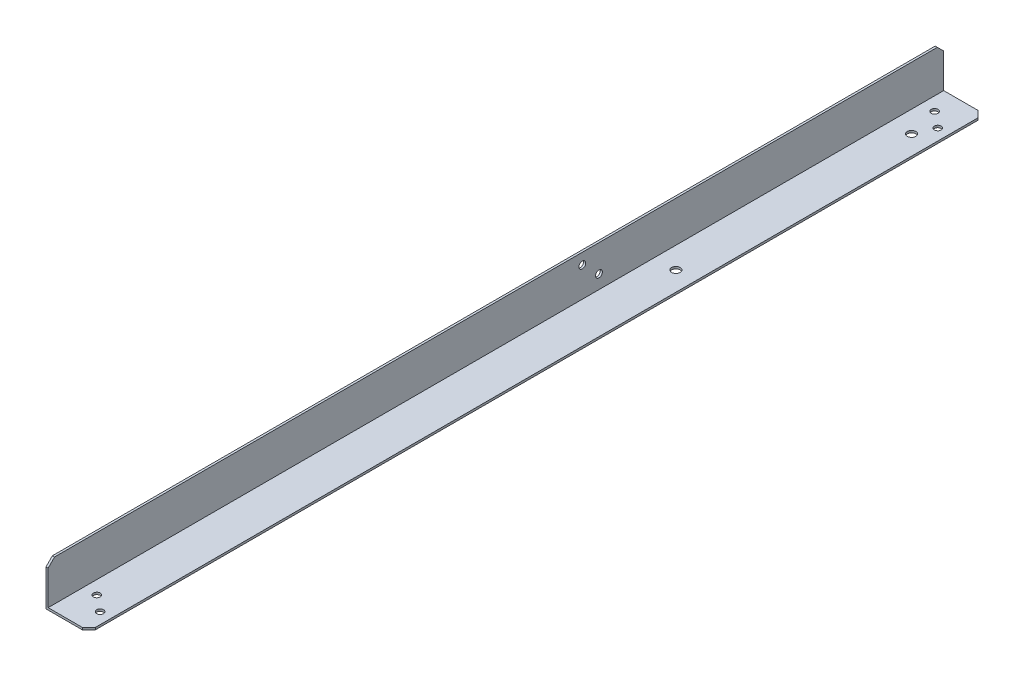
ISO-10303-21;
HEADER;
FILE_DESCRIPTION(('STEP AP214'),'2;1');
FILE_NAME('part.step','',(''),(''),'','','');
FILE_SCHEMA(('AUTOMOTIVE_DESIGN { 1 0 10303 214 1 1 1 1 }'));
ENDSEC;
DATA;
#1=APPLICATION_CONTEXT('core data for automotive mechanical design processes');
#2=APPLICATION_PROTOCOL_DEFINITION('international standard','automotive_design',2000,#1);
#3=PRODUCT_CONTEXT('',#1,'mechanical');
#4=PRODUCT('Part','Part','',(#3));
#5=PRODUCT_RELATED_PRODUCT_CATEGORY('part','',(#4));
#6=PRODUCT_DEFINITION_FORMATION('','',#4);
#7=PRODUCT_DEFINITION_CONTEXT('part definition',#1,'design');
#8=PRODUCT_DEFINITION('design','',#6,#7);
#9=PRODUCT_DEFINITION_SHAPE('','',#8);
#10=(LENGTH_UNIT() NAMED_UNIT(*) SI_UNIT(.MILLI.,.METRE.));
#11=(NAMED_UNIT(*) PLANE_ANGLE_UNIT() SI_UNIT($,.RADIAN.));
#12=(NAMED_UNIT(*) SI_UNIT($,.STERADIAN.) SOLID_ANGLE_UNIT());
#13=UNCERTAINTY_MEASURE_WITH_UNIT(LENGTH_MEASURE(1.E-05),#10,'distance_accuracy_value','');
#14=(GEOMETRIC_REPRESENTATION_CONTEXT(3) GLOBAL_UNCERTAINTY_ASSIGNED_CONTEXT((#13)) GLOBAL_UNIT_ASSIGNED_CONTEXT((#10,
#11,#12)) REPRESENTATION_CONTEXT('',''));
#15=CARTESIAN_POINT('',(0.,0.,0.));
#16=DIRECTION('',(0.,0.,1.));
#17=DIRECTION('',(1.,0.,0.));
#18=AXIS2_PLACEMENT_3D('',#15,#16,#17);
#19=CARTESIAN_POINT('',(20.,1.,418.));
#20=DIRECTION('',(0.,-1.,0.));
#21=DIRECTION('',(1.,0.,0.));
#22=AXIS2_PLACEMENT_3D('',#19,#20,#21);
#23=PLANE('',#22);
#24=CARTESIAN_POINT('',(11.,0.999999999999999,25.));
#25=DIRECTION('',(0.,1.,0.));
#26=DIRECTION('',(0.,0.,1.));
#27=AXIS2_PLACEMENT_3D('',#24,#25,#26);
#28=CIRCLE('',#27,2.);
#29=CARTESIAN_POINT('',(11.,0.999999999999999,27.));
#30=VERTEX_POINT('',#29);
#31=EDGE_CURVE('E250',#30,#30,#28,.T.);
#32=ORIENTED_EDGE('',*,*,#31,.F.);
#33=EDGE_LOOP('',(#32));
#34=FACE_BOUND('',#33,.T.);
#35=CARTESIAN_POINT('',(11.,0.999999999999999,135.));
#36=DIRECTION('',(0.,1.,0.));
#37=DIRECTION('',(0.,0.,1.));
#38=AXIS2_PLACEMENT_3D('',#35,#36,#37);
#39=CIRCLE('',#38,2.);
#40=CARTESIAN_POINT('',(11.,0.999999999999999,137.));
#41=VERTEX_POINT('',#40);
#42=EDGE_CURVE('E244',#41,#41,#39,.T.);
#43=ORIENTED_EDGE('',*,*,#42,.F.);
#44=EDGE_LOOP('',(#43));
#45=FACE_BOUND('',#44,.T.);
#46=CARTESIAN_POINT('',(14.75,1.,407.5));
#47=DIRECTION('',(0.,1.,0.));
#48=DIRECTION('',(0.,0.,1.));
#49=AXIS2_PLACEMENT_3D('',#46,#47,#48);
#50=CIRCLE('',#49,1.59999999999999);
#51=CARTESIAN_POINT('',(14.75,1.,409.1));
#52=VERTEX_POINT('',#51);
#53=EDGE_CURVE('E232',#52,#52,#50,.T.);
#54=ORIENTED_EDGE('',*,*,#53,.F.);
#55=EDGE_LOOP('',(#54));
#56=FACE_BOUND('',#55,.T.);
#57=CARTESIAN_POINT('',(7.25,1.,10.5));
#58=DIRECTION('',(0.,1.,0.));
#59=DIRECTION('',(0.,0.,1.));
#60=AXIS2_PLACEMENT_3D('',#57,#58,#59);
#61=CIRCLE('',#60,1.59999999999999);
#62=CARTESIAN_POINT('',(7.25,1.,12.1));
#63=VERTEX_POINT('',#62);
#64=EDGE_CURVE('E226',#63,#63,#61,.T.);
#65=ORIENTED_EDGE('',*,*,#64,.F.);
#66=EDGE_LOOP('',(#65));
#67=FACE_BOUND('',#66,.T.);
#68=CARTESIAN_POINT('',(14.75,1.,16.5));
#69=DIRECTION('',(0.,1.,0.));
#70=DIRECTION('',(0.,0.,1.));
#71=AXIS2_PLACEMENT_3D('',#68,#69,#70);
#72=CIRCLE('',#71,1.59999999999999);
#73=CARTESIAN_POINT('',(14.75,1.,18.1));
#74=VERTEX_POINT('',#73);
#75=EDGE_CURVE('E220',#74,#74,#72,.T.);
#76=ORIENTED_EDGE('',*,*,#75,.F.);
#77=EDGE_LOOP('',(#76));
#78=FACE_BOUND('',#77,.T.);
#79=DIRECTION('',(-1.,0.,0.));
#80=VECTOR('',#79,1.);
#81=CARTESIAN_POINT('',(20.,1.,418.));
#82=LINE('',#81,#80);
#83=CARTESIAN_POINT('',(17.,1.,418.));
#84=VERTEX_POINT('',#83);
#85=CARTESIAN_POINT('',(1.,0.999999999999998,418.));
#86=VERTEX_POINT('',#85);
#87=EDGE_CURVE('E135',#84,#86,#82,.T.);
#88=ORIENTED_EDGE('',*,*,#87,.F.);
#89=DIRECTION('',(0.707106781186541,0.,-0.707106781186554));
#90=VECTOR('',#89,1.);
#91=CARTESIAN_POINT('',(17.,1.,418.));
#92=LINE('',#91,#90);
#93=CARTESIAN_POINT('',(20.,1.,415.));
#94=VERTEX_POINT('',#93);
#95=EDGE_CURVE('E152',#84,#94,#92,.T.);
#96=ORIENTED_EDGE('',*,*,#95,.T.);
#97=DIRECTION('',(0.,0.,-1.));
#98=VECTOR('',#97,1.);
#99=CARTESIAN_POINT('',(20.,1.,418.));
#100=LINE('',#99,#98);
#101=CARTESIAN_POINT('',(20.,1.,2.99999999999995));
#102=VERTEX_POINT('',#101);
#103=EDGE_CURVE('E145',#94,#102,#100,.T.);
#104=ORIENTED_EDGE('',*,*,#103,.T.);
#105=DIRECTION('',(0.707106781186554,0.,0.707106781186541));
#106=VECTOR('',#105,1.);
#107=CARTESIAN_POINT('',(20.,1.,2.99999999999995));
#108=LINE('',#107,#106);
#109=CARTESIAN_POINT('',(17.,1.,0.));
#110=VERTEX_POINT('',#109);
#111=EDGE_CURVE('E150',#102,#110,#108,.F.);
#112=ORIENTED_EDGE('',*,*,#111,.T.);
#113=DIRECTION('',(-1.,0.,0.));
#114=VECTOR('',#113,1.);
#115=CARTESIAN_POINT('',(20.,1.,0.));
#116=LINE('',#115,#114);
#117=CARTESIAN_POINT('',(1.,0.999999999999998,0.));
#118=VERTEX_POINT('',#117);
#119=EDGE_CURVE('E177',#110,#118,#116,.T.);
#120=ORIENTED_EDGE('',*,*,#119,.T.);
#121=DIRECTION('',(0.,0.,-1.));
#122=VECTOR('',#121,1.);
#123=CARTESIAN_POINT('',(1.,0.999999999999998,418.));
#124=LINE('',#123,#122);
#125=EDGE_CURVE('E190',#86,#118,#124,.T.);
#126=ORIENTED_EDGE('',*,*,#125,.F.);
#127=EDGE_LOOP('',(#88,#96,#104,#112,#120,#126));
#128=FACE_BOUND('',#127,.T.);
#129=CARTESIAN_POINT('',(7.25,1.,401.5));
#130=DIRECTION('',(0.,1.,0.));
#131=DIRECTION('',(0.,0.,1.));
#132=AXIS2_PLACEMENT_3D('',#129,#130,#131);
#133=CIRCLE('',#132,1.59999999999999);
#134=CARTESIAN_POINT('',(7.25,1.,403.1));
#135=VERTEX_POINT('',#134);
#136=EDGE_CURVE('E238',#135,#135,#133,.T.);
#137=ORIENTED_EDGE('',*,*,#136,.F.);
#138=EDGE_LOOP('',(#137));
#139=FACE_BOUND('',#138,.T.);
#140=ADVANCED_FACE('F35',(#34,#45,#56,#67,#78,#128,#139),#23,.F.);
#141=CARTESIAN_POINT('',(1.,0.999999999999998,418.));
#142=DIRECTION('',(-1.,0.,0.));
#143=DIRECTION('',(0.,-1.,0.));
#144=AXIS2_PLACEMENT_3D('',#141,#142,#143);
#145=PLANE('',#144);
#146=CARTESIAN_POINT('',(1.,14.85,168.7));
#147=DIRECTION('',(1.,0.,0.));
#148=DIRECTION('',(0.,0.,-1.));
#149=AXIS2_PLACEMENT_3D('',#146,#147,#148);
#150=CIRCLE('',#149,1.6);
#151=CARTESIAN_POINT('',(1.,14.85,167.1));
#152=VERTEX_POINT('',#151);
#153=EDGE_CURVE('E214',#152,#152,#150,.T.);
#154=ORIENTED_EDGE('',*,*,#153,.F.);
#155=EDGE_LOOP('',(#154));
#156=FACE_BOUND('',#155,.T.);
#157=DIRECTION('',(0.,0.,-1.));
#158=VECTOR('',#157,1.);
#159=CARTESIAN_POINT('',(1.,20.,418.));
#160=LINE('',#159,#158);
#161=CARTESIAN_POINT('',(1.,20.,415.));
#162=VERTEX_POINT('',#161);
#163=CARTESIAN_POINT('',(1.,20.,2.99999999999995));
#164=VERTEX_POINT('',#163);
#165=EDGE_CURVE('E192',#162,#164,#160,.T.);
#166=ORIENTED_EDGE('',*,*,#165,.F.);
#167=DIRECTION('',(0.,-0.707106781186541,0.707106781186554));
#168=VECTOR('',#167,1.);
#169=CARTESIAN_POINT('',(1.,17.,418.));
#170=LINE('',#169,#168);
#171=CARTESIAN_POINT('',(1.,17.,418.));
#172=VERTEX_POINT('',#171);
#173=EDGE_CURVE('E172',#162,#172,#170,.T.);
#174=ORIENTED_EDGE('',*,*,#173,.T.);
#175=DIRECTION('',(0.,1.,0.));
#176=VECTOR('',#175,1.);
#177=CARTESIAN_POINT('',(1.,0.999999999999998,418.));
#178=LINE('',#177,#176);
#179=EDGE_CURVE('E199',#86,#172,#178,.T.);
#180=ORIENTED_EDGE('',*,*,#179,.F.);
#181=ORIENTED_EDGE('',*,*,#125,.T.);
#182=DIRECTION('',(0.,1.,0.));
#183=VECTOR('',#182,1.);
#184=CARTESIAN_POINT('',(1.,0.999999999999998,0.));
#185=LINE('',#184,#183);
#186=CARTESIAN_POINT('',(1.,17.,0.));
#187=VERTEX_POINT('',#186);
#188=EDGE_CURVE('E125',#118,#187,#185,.T.);
#189=ORIENTED_EDGE('',*,*,#188,.T.);
#190=DIRECTION('',(0.,-0.707106781186554,-0.707106781186541));
#191=VECTOR('',#190,1.);
#192=CARTESIAN_POINT('',(1.,20.,2.99999999999995));
#193=LINE('',#192,#191);
#194=EDGE_CURVE('E55',#187,#164,#193,.F.);
#195=ORIENTED_EDGE('',*,*,#194,.T.);
#196=EDGE_LOOP('',(#166,#174,#180,#181,#189,#195));
#197=FACE_BOUND('',#196,.T.);
#198=CARTESIAN_POINT('',(1.,7.35,160.9));
#199=DIRECTION('',(1.,0.,0.));
#200=DIRECTION('',(0.,0.,-1.));
#201=AXIS2_PLACEMENT_3D('',#198,#199,#200);
#202=CIRCLE('',#201,1.6);
#203=CARTESIAN_POINT('',(1.,7.35,159.3));
#204=VERTEX_POINT('',#203);
#205=EDGE_CURVE('E208',#204,#204,#202,.T.);
#206=ORIENTED_EDGE('',*,*,#205,.F.);
#207=EDGE_LOOP('',(#206));
#208=FACE_BOUND('',#207,.T.);
#209=ADVANCED_FACE('F258',(#156,#197,#208),#145,.F.);
#210=CARTESIAN_POINT('',(0.,20.,418.));
#211=DIRECTION('',(1.,0.,0.));
#212=DIRECTION('',(0.,1.,0.));
#213=AXIS2_PLACEMENT_3D('',#210,#211,#212);
#214=PLANE('',#213);
#215=CARTESIAN_POINT('',(0.,14.85,168.7));
#216=DIRECTION('',(1.,0.,0.));
#217=DIRECTION('',(0.,0.,-1.));
#218=AXIS2_PLACEMENT_3D('',#215,#216,#217);
#219=CIRCLE('',#218,1.6);
#220=CARTESIAN_POINT('',(0.,14.85,167.1));
#221=VERTEX_POINT('',#220);
#222=EDGE_CURVE('E211',#221,#221,#219,.T.);
#223=ORIENTED_EDGE('',*,*,#222,.T.);
#224=EDGE_LOOP('',(#223));
#225=FACE_BOUND('',#224,.T.);
#226=CARTESIAN_POINT('',(0.,7.35,160.9));
#227=DIRECTION('',(1.,0.,0.));
#228=DIRECTION('',(0.,0.,-1.));
#229=AXIS2_PLACEMENT_3D('',#226,#227,#228);
#230=CIRCLE('',#229,1.6);
#231=CARTESIAN_POINT('',(0.,7.35,159.3));
#232=VERTEX_POINT('',#231);
#233=EDGE_CURVE('E203',#232,#232,#230,.T.);
#234=ORIENTED_EDGE('',*,*,#233,.T.);
#235=EDGE_LOOP('',(#234));
#236=FACE_BOUND('',#235,.T.);
#237=DIRECTION('',(0.,-1.,0.));
#238=VECTOR('',#237,1.);
#239=CARTESIAN_POINT('',(0.,20.,418.));
#240=LINE('',#239,#238);
#241=CARTESIAN_POINT('',(0.,17.,418.));
#242=VERTEX_POINT('',#241);
#243=CARTESIAN_POINT('',(0.,0.,418.));
#244=VERTEX_POINT('',#243);
#245=EDGE_CURVE('E114',#242,#244,#240,.T.);
#246=ORIENTED_EDGE('',*,*,#245,.F.);
#247=DIRECTION('',(0.,0.707106781186541,-0.707106781186554));
#248=VECTOR('',#247,1.);
#249=CARTESIAN_POINT('',(0.,17.,418.));
#250=LINE('',#249,#248);
#251=CARTESIAN_POINT('',(0.,20.,415.));
#252=VERTEX_POINT('',#251);
#253=EDGE_CURVE('E164',#242,#252,#250,.T.);
#254=ORIENTED_EDGE('',*,*,#253,.T.);
#255=DIRECTION('',(0.,0.,-1.));
#256=VECTOR('',#255,1.);
#257=CARTESIAN_POINT('',(0.,20.,418.));
#258=LINE('',#257,#256);
#259=CARTESIAN_POINT('',(0.,20.,2.99999999999995));
#260=VERTEX_POINT('',#259);
#261=EDGE_CURVE('E196',#252,#260,#258,.T.);
#262=ORIENTED_EDGE('',*,*,#261,.T.);
#263=DIRECTION('',(0.,0.707106781186554,0.707106781186541));
#264=VECTOR('',#263,1.);
#265=CARTESIAN_POINT('',(0.,20.,2.99999999999995));
#266=LINE('',#265,#264);
#267=CARTESIAN_POINT('',(0.,17.,0.));
#268=VERTEX_POINT('',#267);
#269=EDGE_CURVE('E162',#260,#268,#266,.F.);
#270=ORIENTED_EDGE('',*,*,#269,.T.);
#271=DIRECTION('',(0.,-1.,0.));
#272=VECTOR('',#271,1.);
#273=CARTESIAN_POINT('',(0.,20.,0.));
#274=LINE('',#273,#272);
#275=CARTESIAN_POINT('',(0.,0.,0.));
#276=VERTEX_POINT('',#275);
#277=EDGE_CURVE('E138',#268,#276,#274,.T.);
#278=ORIENTED_EDGE('',*,*,#277,.T.);
#279=DIRECTION('',(0.,0.,-1.));
#280=VECTOR('',#279,1.);
#281=CARTESIAN_POINT('',(0.,0.,418.));
#282=LINE('',#281,#280);
#283=EDGE_CURVE('E132',#244,#276,#282,.T.);
#284=ORIENTED_EDGE('',*,*,#283,.F.);
#285=EDGE_LOOP('',(#246,#254,#262,#270,#278,#284));
#286=FACE_BOUND('',#285,.T.);
#287=ADVANCED_FACE('F137',(#225,#236,#286),#214,.F.);
#288=CARTESIAN_POINT('',(0.,0.,418.));
#289=DIRECTION('',(0.,1.,0.));
#290=DIRECTION('',(0.,0.,1.));
#291=AXIS2_PLACEMENT_3D('',#288,#289,#290);
#292=PLANE('',#291);
#293=CARTESIAN_POINT('',(11.,0.,25.));
#294=DIRECTION('',(0.,1.,0.));
#295=DIRECTION('',(0.,0.,1.));
#296=AXIS2_PLACEMENT_3D('',#293,#294,#295);
#297=CIRCLE('',#296,2.);
#298=CARTESIAN_POINT('',(11.,0.,27.));
#299=VERTEX_POINT('',#298);
#300=EDGE_CURVE('E247',#299,#299,#297,.T.);
#301=ORIENTED_EDGE('',*,*,#300,.T.);
#302=EDGE_LOOP('',(#301));
#303=FACE_BOUND('',#302,.T.);
#304=CARTESIAN_POINT('',(11.,0.,135.));
#305=DIRECTION('',(0.,1.,0.));
#306=DIRECTION('',(0.,0.,1.));
#307=AXIS2_PLACEMENT_3D('',#304,#305,#306);
#308=CIRCLE('',#307,2.);
#309=CARTESIAN_POINT('',(11.,0.,137.));
#310=VERTEX_POINT('',#309);
#311=EDGE_CURVE('E241',#310,#310,#308,.T.);
#312=ORIENTED_EDGE('',*,*,#311,.T.);
#313=EDGE_LOOP('',(#312));
#314=FACE_BOUND('',#313,.T.);
#315=CARTESIAN_POINT('',(7.25,0.,401.5));
#316=DIRECTION('',(0.,1.,0.));
#317=DIRECTION('',(0.,0.,1.));
#318=AXIS2_PLACEMENT_3D('',#315,#316,#317);
#319=CIRCLE('',#318,1.59999999999999);
#320=CARTESIAN_POINT('',(7.25,0.,403.1));
#321=VERTEX_POINT('',#320);
#322=EDGE_CURVE('E235',#321,#321,#319,.T.);
#323=ORIENTED_EDGE('',*,*,#322,.T.);
#324=EDGE_LOOP('',(#323));
#325=FACE_BOUND('',#324,.T.);
#326=CARTESIAN_POINT('',(14.75,0.,407.5));
#327=DIRECTION('',(0.,1.,0.));
#328=DIRECTION('',(0.,0.,1.));
#329=AXIS2_PLACEMENT_3D('',#326,#327,#328);
#330=CIRCLE('',#329,1.59999999999999);
#331=CARTESIAN_POINT('',(14.75,0.,409.1));
#332=VERTEX_POINT('',#331);
#333=EDGE_CURVE('E229',#332,#332,#330,.T.);
#334=ORIENTED_EDGE('',*,*,#333,.T.);
#335=EDGE_LOOP('',(#334));
#336=FACE_BOUND('',#335,.T.);
#337=CARTESIAN_POINT('',(7.25,0.,10.5));
#338=DIRECTION('',(0.,1.,0.));
#339=DIRECTION('',(0.,0.,1.));
#340=AXIS2_PLACEMENT_3D('',#337,#338,#339);
#341=CIRCLE('',#340,1.59999999999999);
#342=CARTESIAN_POINT('',(7.25,0.,12.1));
#343=VERTEX_POINT('',#342);
#344=EDGE_CURVE('E223',#343,#343,#341,.T.);
#345=ORIENTED_EDGE('',*,*,#344,.T.);
#346=EDGE_LOOP('',(#345));
#347=FACE_BOUND('',#346,.T.);
#348=CARTESIAN_POINT('',(14.75,0.,16.5));
#349=DIRECTION('',(0.,1.,0.));
#350=DIRECTION('',(0.,0.,1.));
#351=AXIS2_PLACEMENT_3D('',#348,#349,#350);
#352=CIRCLE('',#351,1.59999999999999);
#353=CARTESIAN_POINT('',(14.75,0.,18.1));
#354=VERTEX_POINT('',#353);
#355=EDGE_CURVE('E217',#354,#354,#352,.T.);
#356=ORIENTED_EDGE('',*,*,#355,.T.);
#357=EDGE_LOOP('',(#356));
#358=FACE_BOUND('',#357,.T.);
#359=DIRECTION('',(0.,0.,-1.));
#360=VECTOR('',#359,1.);
#361=CARTESIAN_POINT('',(20.,0.,418.));
#362=LINE('',#361,#360);
#363=CARTESIAN_POINT('',(20.,0.,415.));
#364=VERTEX_POINT('',#363);
#365=CARTESIAN_POINT('',(20.,0.,2.99999999999995));
#366=VERTEX_POINT('',#365);
#367=EDGE_CURVE('E140',#364,#366,#362,.T.);
#368=ORIENTED_EDGE('',*,*,#367,.F.);
#369=DIRECTION('',(-0.707106781186541,0.,0.707106781186554));
#370=VECTOR('',#369,1.);
#371=CARTESIAN_POINT('',(17.,0.,418.));
#372=LINE('',#371,#370);
#373=CARTESIAN_POINT('',(17.,0.,418.));
#374=VERTEX_POINT('',#373);
#375=EDGE_CURVE('E134',#364,#374,#372,.T.);
#376=ORIENTED_EDGE('',*,*,#375,.T.);
#377=DIRECTION('',(1.,0.,0.));
#378=VECTOR('',#377,1.);
#379=CARTESIAN_POINT('',(0.,0.,418.));
#380=LINE('',#379,#378);
#381=EDGE_CURVE('E118',#244,#374,#380,.T.);
#382=ORIENTED_EDGE('',*,*,#381,.F.);
#383=ORIENTED_EDGE('',*,*,#283,.T.);
#384=DIRECTION('',(1.,0.,0.));
#385=VECTOR('',#384,1.);
#386=CARTESIAN_POINT('',(0.,0.,0.));
#387=LINE('',#386,#385);
#388=CARTESIAN_POINT('',(17.,0.,0.));
#389=VERTEX_POINT('',#388);
#390=EDGE_CURVE('E176',#276,#389,#387,.T.);
#391=ORIENTED_EDGE('',*,*,#390,.T.);
#392=DIRECTION('',(-0.707106781186554,0.,-0.707106781186541));
#393=VECTOR('',#392,1.);
#394=CARTESIAN_POINT('',(20.,0.,2.99999999999995));
#395=LINE('',#394,#393);
#396=EDGE_CURVE('E159',#389,#366,#395,.F.);
#397=ORIENTED_EDGE('',*,*,#396,.T.);
#398=EDGE_LOOP('',(#368,#376,#382,#383,#391,#397));
#399=FACE_BOUND('',#398,.T.);
#400=ADVANCED_FACE('F130',(#303,#314,#325,#336,#347,#358,#399),#292,.F.);
#401=CARTESIAN_POINT('',(20.,0.,418.));
#402=DIRECTION('',(-1.,0.,0.));
#403=DIRECTION('',(0.,0.,1.));
#404=AXIS2_PLACEMENT_3D('',#401,#402,#403);
#405=PLANE('',#404);
#406=ORIENTED_EDGE('',*,*,#103,.F.);
#407=DIRECTION('',(0.,-1.,0.));
#408=VECTOR('',#407,1.);
#409=CARTESIAN_POINT('',(20.,0.,415.));
#410=LINE('',#409,#408);
#411=EDGE_CURVE('E157',#94,#364,#410,.T.);
#412=ORIENTED_EDGE('',*,*,#411,.T.);
#413=ORIENTED_EDGE('',*,*,#367,.T.);
#414=DIRECTION('',(0.,1.,0.));
#415=VECTOR('',#414,1.);
#416=CARTESIAN_POINT('',(20.,0.,2.99999999999995));
#417=LINE('',#416,#415);
#418=EDGE_CURVE('E154',#366,#102,#417,.T.);
#419=ORIENTED_EDGE('',*,*,#418,.T.);
#420=EDGE_LOOP('',(#406,#412,#413,#419));
#421=FACE_BOUND('',#420,.T.);
#422=ADVANCED_FACE('F185',(#421),#405,.F.);
#423=CARTESIAN_POINT('',(1.,20.,418.));
#424=DIRECTION('',(0.,-1.,0.));
#425=DIRECTION('',(0.,0.,-1.));
#426=AXIS2_PLACEMENT_3D('',#423,#424,#425);
#427=PLANE('',#426);
#428=ORIENTED_EDGE('',*,*,#261,.F.);
#429=DIRECTION('',(1.,0.,0.));
#430=VECTOR('',#429,1.);
#431=CARTESIAN_POINT('',(1.,20.,415.));
#432=LINE('',#431,#430);
#433=EDGE_CURVE('E169',#252,#162,#432,.T.);
#434=ORIENTED_EDGE('',*,*,#433,.T.);
#435=ORIENTED_EDGE('',*,*,#165,.T.);
#436=DIRECTION('',(-1.,0.,0.));
#437=VECTOR('',#436,1.);
#438=CARTESIAN_POINT('',(1.,20.,2.99999999999995));
#439=LINE('',#438,#437);
#440=EDGE_CURVE('E166',#164,#260,#439,.T.);
#441=ORIENTED_EDGE('',*,*,#440,.T.);
#442=EDGE_LOOP('',(#428,#434,#435,#441));
#443=FACE_BOUND('',#442,.T.);
#444=ADVANCED_FACE('F292',(#443),#427,.F.);
#445=CARTESIAN_POINT('',(0.,0.,418.));
#446=DIRECTION('',(0.,0.,1.));
#447=DIRECTION('',(1.,0.,0.));
#448=AXIS2_PLACEMENT_3D('',#445,#446,#447);
#449=PLANE('',#448);
#450=ORIENTED_EDGE('',*,*,#381,.T.);
#451=DIRECTION('',(0.,1.,0.));
#452=VECTOR('',#451,1.);
#453=CARTESIAN_POINT('',(17.,1.,418.));
#454=LINE('',#453,#452);
#455=EDGE_CURVE('E142',#374,#84,#454,.T.);
#456=ORIENTED_EDGE('',*,*,#455,.T.);
#457=ORIENTED_EDGE('',*,*,#87,.T.);
#458=ORIENTED_EDGE('',*,*,#179,.T.);
#459=DIRECTION('',(-1.,0.,0.));
#460=VECTOR('',#459,1.);
#461=CARTESIAN_POINT('',(0.,17.,418.));
#462=LINE('',#461,#460);
#463=EDGE_CURVE('E122',#172,#242,#462,.T.);
#464=ORIENTED_EDGE('',*,*,#463,.T.);
#465=ORIENTED_EDGE('',*,*,#245,.T.);
#466=EDGE_LOOP('',(#450,#456,#457,#458,#464,#465));
#467=FACE_BOUND('',#466,.T.);
#468=ADVANCED_FACE('F116',(#467),#449,.T.);
#469=CARTESIAN_POINT('',(0.,0.,0.));
#470=DIRECTION('',(0.,0.,1.));
#471=DIRECTION('',(1.,0.,0.));
#472=AXIS2_PLACEMENT_3D('',#469,#470,#471);
#473=PLANE('',#472);
#474=ORIENTED_EDGE('',*,*,#277,.F.);
#475=DIRECTION('',(1.,0.,0.));
#476=VECTOR('',#475,1.);
#477=CARTESIAN_POINT('',(0.,17.,0.));
#478=LINE('',#477,#476);
#479=EDGE_CURVE('E11',#268,#187,#478,.T.);
#480=ORIENTED_EDGE('',*,*,#479,.T.);
#481=ORIENTED_EDGE('',*,*,#188,.F.);
#482=ORIENTED_EDGE('',*,*,#119,.F.);
#483=DIRECTION('',(0.,-1.,0.));
#484=VECTOR('',#483,1.);
#485=CARTESIAN_POINT('',(17.,0.,0.));
#486=LINE('',#485,#484);
#487=EDGE_CURVE('E43',#110,#389,#486,.T.);
#488=ORIENTED_EDGE('',*,*,#487,.T.);
#489=ORIENTED_EDGE('',*,*,#390,.F.);
#490=EDGE_LOOP('',(#474,#480,#481,#482,#488,#489));
#491=FACE_BOUND('',#490,.T.);
#492=ADVANCED_FACE('F175',(#491),#473,.F.);
#493=CARTESIAN_POINT('',(17.,0.,418.));
#494=DIRECTION('',(0.707106781186554,0.,0.707106781186541));
#495=DIRECTION('',(0.,-1.,0.));
#496=AXIS2_PLACEMENT_3D('',#493,#494,#495);
#497=PLANE('',#496);
#498=ORIENTED_EDGE('',*,*,#375,.F.);
#499=ORIENTED_EDGE('',*,*,#411,.F.);
#500=ORIENTED_EDGE('',*,*,#95,.F.);
#501=ORIENTED_EDGE('',*,*,#455,.F.);
#502=EDGE_LOOP('',(#498,#499,#500,#501));
#503=FACE_BOUND('',#502,.T.);
#504=ADVANCED_FACE('F295',(#503),#497,.T.);
#505=CARTESIAN_POINT('',(0.,17.,418.));
#506=DIRECTION('',(0.,0.707106781186554,0.707106781186541));
#507=DIRECTION('',(1.,0.,0.));
#508=AXIS2_PLACEMENT_3D('',#505,#506,#507);
#509=PLANE('',#508);
#510=ORIENTED_EDGE('',*,*,#173,.F.);
#511=ORIENTED_EDGE('',*,*,#433,.F.);
#512=ORIENTED_EDGE('',*,*,#253,.F.);
#513=ORIENTED_EDGE('',*,*,#463,.F.);
#514=EDGE_LOOP('',(#510,#511,#512,#513));
#515=FACE_BOUND('',#514,.T.);
#516=ADVANCED_FACE('F312',(#515),#509,.T.);
#517=CARTESIAN_POINT('',(1.,20.,2.99999999999995));
#518=DIRECTION('',(0.,-0.707106781186541,0.707106781186554));
#519=DIRECTION('',(-1.,0.,0.));
#520=AXIS2_PLACEMENT_3D('',#517,#518,#519);
#521=PLANE('',#520);
#522=ORIENTED_EDGE('',*,*,#194,.F.);
#523=ORIENTED_EDGE('',*,*,#479,.F.);
#524=ORIENTED_EDGE('',*,*,#269,.F.);
#525=ORIENTED_EDGE('',*,*,#440,.F.);
#526=EDGE_LOOP('',(#522,#523,#524,#525));
#527=FACE_BOUND('',#526,.T.);
#528=ADVANCED_FACE('F315',(#527),#521,.F.);
#529=CARTESIAN_POINT('',(20.,0.,2.99999999999995));
#530=DIRECTION('',(-0.707106781186541,0.,0.707106781186554));
#531=DIRECTION('',(0.,1.,0.));
#532=AXIS2_PLACEMENT_3D('',#529,#530,#531);
#533=PLANE('',#532);
#534=ORIENTED_EDGE('',*,*,#396,.F.);
#535=ORIENTED_EDGE('',*,*,#487,.F.);
#536=ORIENTED_EDGE('',*,*,#111,.F.);
#537=ORIENTED_EDGE('',*,*,#418,.F.);
#538=EDGE_LOOP('',(#534,#535,#536,#537));
#539=FACE_BOUND('',#538,.T.);
#540=ADVANCED_FACE('F37',(#539),#533,.F.);
#541=CARTESIAN_POINT('',(1.,7.35,160.9));
#542=DIRECTION('',(1.,0.,0.));
#543=DIRECTION('',(0.,0.,-1.));
#544=AXIS2_PLACEMENT_3D('',#541,#542,#543);
#545=CYLINDRICAL_SURFACE('',#544,1.6);
#546=ORIENTED_EDGE('',*,*,#233,.F.);
#547=EDGE_LOOP('',(#546));
#548=FACE_BOUND('',#547,.T.);
#549=ORIENTED_EDGE('',*,*,#205,.T.);
#550=EDGE_LOOP('',(#549));
#551=FACE_BOUND('',#550,.T.);
#552=ADVANCED_FACE('F281',(#548,#551),#545,.F.);
#553=CARTESIAN_POINT('',(1.,14.85,168.7));
#554=DIRECTION('',(1.,0.,0.));
#555=DIRECTION('',(0.,0.,-1.));
#556=AXIS2_PLACEMENT_3D('',#553,#554,#555);
#557=CYLINDRICAL_SURFACE('',#556,1.6);
#558=ORIENTED_EDGE('',*,*,#222,.F.);
#559=EDGE_LOOP('',(#558));
#560=FACE_BOUND('',#559,.T.);
#561=ORIENTED_EDGE('',*,*,#153,.T.);
#562=EDGE_LOOP('',(#561));
#563=FACE_BOUND('',#562,.T.);
#564=ADVANCED_FACE('F271',(#560,#563),#557,.F.);
#565=CARTESIAN_POINT('',(14.75,0.999999999999999,16.5));
#566=DIRECTION('',(0.,1.,0.));
#567=DIRECTION('',(0.,0.,1.));
#568=AXIS2_PLACEMENT_3D('',#565,#566,#567);
#569=CYLINDRICAL_SURFACE('',#568,1.59999999999999);
#570=ORIENTED_EDGE('',*,*,#355,.F.);
#571=EDGE_LOOP('',(#570));
#572=FACE_BOUND('',#571,.T.);
#573=ORIENTED_EDGE('',*,*,#75,.T.);
#574=EDGE_LOOP('',(#573));
#575=FACE_BOUND('',#574,.T.);
#576=ADVANCED_FACE('F268',(#572,#575),#569,.F.);
#577=CARTESIAN_POINT('',(7.25,0.999999999999998,10.5));
#578=DIRECTION('',(0.,1.,0.));
#579=DIRECTION('',(0.,0.,1.));
#580=AXIS2_PLACEMENT_3D('',#577,#578,#579);
#581=CYLINDRICAL_SURFACE('',#580,1.59999999999999);
#582=ORIENTED_EDGE('',*,*,#344,.F.);
#583=EDGE_LOOP('',(#582));
#584=FACE_BOUND('',#583,.T.);
#585=ORIENTED_EDGE('',*,*,#64,.T.);
#586=EDGE_LOOP('',(#585));
#587=FACE_BOUND('',#586,.T.);
#588=ADVANCED_FACE('F270',(#584,#587),#581,.F.);
#589=CARTESIAN_POINT('',(14.75,0.999999999999999,407.5));
#590=DIRECTION('',(0.,1.,0.));
#591=DIRECTION('',(0.,0.,1.));
#592=AXIS2_PLACEMENT_3D('',#589,#590,#591);
#593=CYLINDRICAL_SURFACE('',#592,1.59999999999999);
#594=ORIENTED_EDGE('',*,*,#333,.F.);
#595=EDGE_LOOP('',(#594));
#596=FACE_BOUND('',#595,.T.);
#597=ORIENTED_EDGE('',*,*,#53,.T.);
#598=EDGE_LOOP('',(#597));
#599=FACE_BOUND('',#598,.T.);
#600=ADVANCED_FACE('F278',(#596,#599),#593,.F.);
#601=CARTESIAN_POINT('',(7.25,0.999999999999998,401.5));
#602=DIRECTION('',(0.,1.,0.));
#603=DIRECTION('',(0.,0.,1.));
#604=AXIS2_PLACEMENT_3D('',#601,#602,#603);
#605=CYLINDRICAL_SURFACE('',#604,1.59999999999999);
#606=ORIENTED_EDGE('',*,*,#322,.F.);
#607=EDGE_LOOP('',(#606));
#608=FACE_BOUND('',#607,.T.);
#609=ORIENTED_EDGE('',*,*,#136,.T.);
#610=EDGE_LOOP('',(#609));
#611=FACE_BOUND('',#610,.T.);
#612=ADVANCED_FACE('F363',(#608,#611),#605,.F.);
#613=CARTESIAN_POINT('',(11.,0.999999999999999,135.));
#614=DIRECTION('',(0.,1.,0.));
#615=DIRECTION('',(0.,0.,1.));
#616=AXIS2_PLACEMENT_3D('',#613,#614,#615);
#617=CYLINDRICAL_SURFACE('',#616,2.);
#618=ORIENTED_EDGE('',*,*,#311,.F.);
#619=EDGE_LOOP('',(#618));
#620=FACE_BOUND('',#619,.T.);
#621=ORIENTED_EDGE('',*,*,#42,.T.);
#622=EDGE_LOOP('',(#621));
#623=FACE_BOUND('',#622,.T.);
#624=ADVANCED_FACE('F372',(#620,#623),#617,.F.);
#625=CARTESIAN_POINT('',(11.,0.999999999999999,25.));
#626=DIRECTION('',(0.,1.,0.));
#627=DIRECTION('',(0.,0.,1.));
#628=AXIS2_PLACEMENT_3D('',#625,#626,#627);
#629=CYLINDRICAL_SURFACE('',#628,2.);
#630=ORIENTED_EDGE('',*,*,#300,.F.);
#631=EDGE_LOOP('',(#630));
#632=FACE_BOUND('',#631,.T.);
#633=ORIENTED_EDGE('',*,*,#31,.T.);
#634=EDGE_LOOP('',(#633));
#635=FACE_BOUND('',#634,.T.);
#636=ADVANCED_FACE('F254',(#632,#635),#629,.F.);
#637=CLOSED_SHELL('',(#140,#209,#287,#400,#422,#444,#468,#492,#504,#516,#528,#540,#552,#564,
#576,#588,#600,#612,#624,#636));
#638=MANIFOLD_SOLID_BREP('B2',#637);
#639=ADVANCED_BREP_SHAPE_REPRESENTATION('',(#18,#638),#14);
#640=SHAPE_DEFINITION_REPRESENTATION(#9,#639);
ENDSEC;
END-ISO-10303-21;
